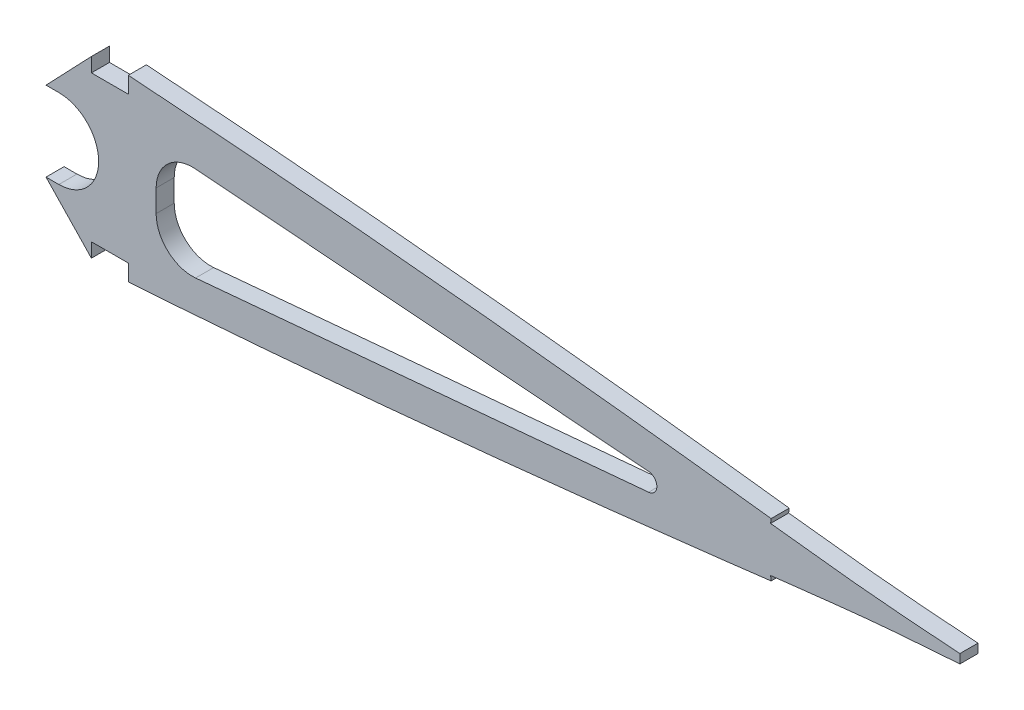
ISO-10303-21;
HEADER;
FILE_DESCRIPTION(('STEP AP214'),'2;1');
FILE_NAME('part.step','',(''),(''),'','','');
FILE_SCHEMA(('AUTOMOTIVE_DESIGN { 1 0 10303 214 1 1 1 1 }'));
ENDSEC;
DATA;
#1=APPLICATION_CONTEXT('core data for automotive mechanical design processes');
#2=APPLICATION_PROTOCOL_DEFINITION('international standard','automotive_design',2000,#1);
#3=PRODUCT_CONTEXT('',#1,'mechanical');
#4=PRODUCT('Part','Part','',(#3));
#5=PRODUCT_RELATED_PRODUCT_CATEGORY('part','',(#4));
#6=PRODUCT_DEFINITION_FORMATION('','',#4);
#7=PRODUCT_DEFINITION_CONTEXT('part definition',#1,'design');
#8=PRODUCT_DEFINITION('design','',#6,#7);
#9=PRODUCT_DEFINITION_SHAPE('','',#8);
#10=(LENGTH_UNIT() NAMED_UNIT(*) SI_UNIT(.MILLI.,.METRE.));
#11=(NAMED_UNIT(*) PLANE_ANGLE_UNIT() SI_UNIT($,.RADIAN.));
#12=(NAMED_UNIT(*) SI_UNIT($,.STERADIAN.) SOLID_ANGLE_UNIT());
#13=UNCERTAINTY_MEASURE_WITH_UNIT(LENGTH_MEASURE(1.E-05),#10,'distance_accuracy_value','');
#14=(GEOMETRIC_REPRESENTATION_CONTEXT(3) GLOBAL_UNCERTAINTY_ASSIGNED_CONTEXT((#13)) GLOBAL_UNIT_ASSIGNED_CONTEXT((#10,
#11,#12)) REPRESENTATION_CONTEXT('',''));
#15=CARTESIAN_POINT('',(0.,0.,0.));
#16=DIRECTION('',(0.,0.,1.));
#17=DIRECTION('',(1.,0.,0.));
#18=AXIS2_PLACEMENT_3D('',#15,#16,#17);
#19=CARTESIAN_POINT('',(27.0520222147279,292.342130035298,-3.175));
#20=DIRECTION('',(0.999999998914993,-4.65834175230842E-05,0.));
#21=DIRECTION('',(4.65834175230842E-05,0.999999998914993,0.));
#22=AXIS2_PLACEMENT_3D('',#19,#20,#21);
#23=PLANE('',#22);
#24=DIRECTION('',(4.65834175230842E-05,0.999999998914993,0.));
#25=VECTOR('',#24,1.);
#26=CARTESIAN_POINT('',(27.0520222147279,292.342130035298,0.));
#27=LINE('',#26,#25);
#28=CARTESIAN_POINT('',(27.0518880174241,289.461334448386,0.));
#29=VERTEX_POINT('',#28);
#30=CARTESIAN_POINT('',(27.0520222147279,292.342130035298,0.));
#31=VERTEX_POINT('',#30);
#32=EDGE_CURVE('E246',#29,#31,#27,.T.);
#33=ORIENTED_EDGE('',*,*,#32,.T.);
#34=DIRECTION('',(0.,0.,1.));
#35=VECTOR('',#34,1.);
#36=CARTESIAN_POINT('',(27.0520222147279,292.342130035298,-3.175));
#37=LINE('',#36,#35);
#38=CARTESIAN_POINT('',(27.0520222147279,292.342130035298,-3.175));
#39=VERTEX_POINT('',#38);
#40=EDGE_CURVE('E10',#39,#31,#37,.T.);
#41=ORIENTED_EDGE('',*,*,#40,.F.);
#42=DIRECTION('',(4.65834175230842E-05,0.999999998914993,0.));
#43=VECTOR('',#42,1.);
#44=CARTESIAN_POINT('',(27.0520222147279,292.342130035298,-3.175));
#45=LINE('',#44,#43);
#46=CARTESIAN_POINT('',(27.0518880174241,289.461334448386,-3.175));
#47=VERTEX_POINT('',#46);
#48=EDGE_CURVE('E343',#47,#39,#45,.T.);
#49=ORIENTED_EDGE('',*,*,#48,.F.);
#50=DIRECTION('',(0.,0.,1.));
#51=VECTOR('',#50,1.);
#52=CARTESIAN_POINT('',(27.0518880174241,289.461334448386,-3.175));
#53=LINE('',#52,#51);
#54=EDGE_CURVE('E350',#47,#29,#53,.T.);
#55=ORIENTED_EDGE('',*,*,#54,.T.);
#56=EDGE_LOOP('',(#33,#41,#49,#55));
#57=FACE_BOUND('',#56,.T.);
#58=ADVANCED_FACE('F16',(#57),#23,.F.);
#59=CARTESIAN_POINT('',(27.0520222147279,292.342130035298,-3.175));
#60=CARTESIAN_POINT('',(31.6448637242133,292.031066167189,-3.175));
#61=CARTESIAN_POINT('',(39.9442480850821,291.431511502589,-3.175));
#62=CARTESIAN_POINT('',(51.9525524052383,290.475454819605,-3.175));
#63=CARTESIAN_POINT('',(64.9133034438081,289.36652345483,-3.175));
#64=CARTESIAN_POINT('',(79.6230501651415,288.001144890367,-3.175));
#65=CARTESIAN_POINT('',(95.9350363173077,286.368536230563,-3.175));
#66=CARTESIAN_POINT('',(111.74378553897,284.671478377911,-3.175));
#67=CARTESIAN_POINT('',(126.336494658498,283.009327899495,-3.175));
#68=CARTESIAN_POINT('',(135.609512962413,281.883858707602,-3.175));
#69=CARTESIAN_POINT('',(139.848208017424,281.369406935601,-3.175));
#70=B_SPLINE_CURVE_WITH_KNOTS('',3,(#59,#60,#61,#62,#63,#64,#65,#66,#67,#68,#69),.UNSPECIFIED.,
.F.,.F.,(4,1,1,1,1,1,1,1,4),(0.,0.121843925116102,0.220242357516159,0.318846892350224,
0.466148197253553,0.611258014801546,0.752755651791799,0.886984651406637,1.),.UNSPECIFIED.);
#71=DIRECTION('',(0.,0.,1.));
#72=VECTOR('',#71,1.);
#73=SURFACE_OF_LINEAR_EXTRUSION('',#70,#72);
#74=CARTESIAN_POINT('',(27.0520222147279,292.342130035298,0.));
#75=CARTESIAN_POINT('',(31.6448637242133,292.031066167189,0.));
#76=CARTESIAN_POINT('',(39.9442480850821,291.431511502589,0.));
#77=CARTESIAN_POINT('',(51.9525524052383,290.475454819605,0.));
#78=CARTESIAN_POINT('',(64.9133034438081,289.36652345483,0.));
#79=CARTESIAN_POINT('',(79.6230501651415,288.001144890367,0.));
#80=CARTESIAN_POINT('',(95.9350363173077,286.368536230563,0.));
#81=CARTESIAN_POINT('',(111.74378553897,284.671478377911,0.));
#82=CARTESIAN_POINT('',(126.336494658498,283.009327899495,0.));
#83=CARTESIAN_POINT('',(135.609512962413,281.883858707602,0.));
#84=CARTESIAN_POINT('',(139.848208017424,281.369406935601,0.));
#85=B_SPLINE_CURVE_WITH_KNOTS('',3,(#74,#75,#76,#77,#78,#79,#80,#81,#82,#83,#84),.UNSPECIFIED.,
.F.,.F.,(4,1,1,1,1,1,1,1,4),(0.,0.121843925116102,0.220242357516159,0.318846892350224,
0.466148197253553,0.611258014801546,0.752755651791799,0.886984651406637,1.),.UNSPECIFIED.);
#86=CARTESIAN_POINT('',(139.848208017424,281.369406935601,0.));
#87=VERTEX_POINT('',#86);
#88=EDGE_CURVE('E240',#31,#87,#85,.T.);
#89=ORIENTED_EDGE('',*,*,#88,.T.);
#90=DIRECTION('',(0.,0.,1.));
#91=VECTOR('',#90,1.);
#92=CARTESIAN_POINT('',(139.848208017424,281.369406935601,-3.175));
#93=LINE('',#92,#91);
#94=CARTESIAN_POINT('',(139.848208017424,281.369406935601,-3.175));
#95=VERTEX_POINT('',#94);
#96=EDGE_CURVE('E24',#95,#87,#93,.T.);
#97=ORIENTED_EDGE('',*,*,#96,.F.);
#98=EDGE_CURVE('E134',#39,#95,#70,.T.);
#99=ORIENTED_EDGE('',*,*,#98,.F.);
#100=ORIENTED_EDGE('',*,*,#40,.T.);
#101=EDGE_LOOP('',(#89,#97,#99,#100));
#102=FACE_BOUND('',#101,.T.);
#103=ADVANCED_FACE('F465',(#102),#73,.F.);
#104=CARTESIAN_POINT('',(139.848208017424,281.369406935601,-3.175));
#105=DIRECTION('',(-0.992570614202239,0.121669946257036,0.));
#106=DIRECTION('',(-0.121669946257036,-0.992570614202239,0.));
#107=AXIS2_PLACEMENT_3D('',#104,#105,#106);
#108=PLANE('',#107);
#109=DIRECTION('',(-0.121669946257036,-0.992570614202239,0.));
#110=VECTOR('',#109,1.);
#111=CARTESIAN_POINT('',(139.848208017424,281.369406935601,0.));
#112=LINE('',#111,#110);
#113=CARTESIAN_POINT('',(139.751688017424,280.582006935601,0.));
#114=VERTEX_POINT('',#113);
#115=EDGE_CURVE('E245',#87,#114,#112,.T.);
#116=ORIENTED_EDGE('',*,*,#115,.T.);
#117=DIRECTION('',(0.,0.,1.));
#118=VECTOR('',#117,1.);
#119=CARTESIAN_POINT('',(139.751688017424,280.582006935601,-3.175));
#120=LINE('',#119,#118);
#121=CARTESIAN_POINT('',(139.751688017424,280.582006935601,-3.175));
#122=VERTEX_POINT('',#121);
#123=EDGE_CURVE('E409',#122,#114,#120,.T.);
#124=ORIENTED_EDGE('',*,*,#123,.F.);
#125=DIRECTION('',(-0.121669946257036,-0.992570614202239,0.));
#126=VECTOR('',#125,1.);
#127=CARTESIAN_POINT('',(139.848208017424,281.369406935601,-3.175));
#128=LINE('',#127,#126);
#129=EDGE_CURVE('E417',#95,#122,#128,.T.);
#130=ORIENTED_EDGE('',*,*,#129,.F.);
#131=ORIENTED_EDGE('',*,*,#96,.T.);
#132=EDGE_LOOP('',(#116,#124,#130,#131));
#133=FACE_BOUND('',#132,.T.);
#134=ADVANCED_FACE('F415',(#133),#108,.F.);
#135=CARTESIAN_POINT('',(139.751688017424,280.582006935601,-3.175));
#136=CARTESIAN_POINT('',(141.693886224445,280.359170647431,-3.175));
#137=CARTESIAN_POINT('',(147.65623542696,279.675086108449,-3.175));
#138=CARTESIAN_POINT('',(158.71215565358,278.413339142407,-3.175));
#139=CARTESIAN_POINT('',(167.862262086692,277.778329081846,-3.175));
#140=CARTESIAN_POINT('',(172.974888017424,277.423516935601,-3.175));
#141=B_SPLINE_CURVE_WITH_KNOTS('',3,(#135,#136,#137,#138,#139,#140),.UNSPECIFIED.,.F.,.F.,(4,1,
1,4),(0.,0.175716345954333,0.539431151456154,1.),.UNSPECIFIED.);
#142=DIRECTION('',(0.,0.,1.));
#143=VECTOR('',#142,1.);
#144=SURFACE_OF_LINEAR_EXTRUSION('',#141,#143);
#145=CARTESIAN_POINT('',(139.751688017424,280.582006935601,0.));
#146=CARTESIAN_POINT('',(141.693886224445,280.359170647431,0.));
#147=CARTESIAN_POINT('',(147.65623542696,279.675086108449,0.));
#148=CARTESIAN_POINT('',(158.71215565358,278.413339142407,0.));
#149=CARTESIAN_POINT('',(167.862262086692,277.778329081846,0.));
#150=CARTESIAN_POINT('',(172.974888017424,277.423516935601,0.));
#151=B_SPLINE_CURVE_WITH_KNOTS('',3,(#145,#146,#147,#148,#149,#150),.UNSPECIFIED.,.F.,.F.,(4,1,
1,4),(0.,0.175716345954333,0.539431151456154,1.),.UNSPECIFIED.);
#152=CARTESIAN_POINT('',(172.974888017424,277.423516935601,0.));
#153=VERTEX_POINT('',#152);
#154=EDGE_CURVE('E252',#114,#153,#151,.T.);
#155=ORIENTED_EDGE('',*,*,#154,.T.);
#156=DIRECTION('',(0.,0.,1.));
#157=VECTOR('',#156,1.);
#158=CARTESIAN_POINT('',(172.974888017424,277.423516935601,-3.175));
#159=LINE('',#158,#157);
#160=CARTESIAN_POINT('',(172.974888017424,277.423516935601,-3.175));
#161=VERTEX_POINT('',#160);
#162=EDGE_CURVE('E406',#161,#153,#159,.T.);
#163=ORIENTED_EDGE('',*,*,#162,.F.);
#164=EDGE_CURVE('E435',#122,#161,#141,.T.);
#165=ORIENTED_EDGE('',*,*,#164,.F.);
#166=ORIENTED_EDGE('',*,*,#123,.T.);
#167=EDGE_LOOP('',(#155,#163,#165,#166));
#168=FACE_BOUND('',#167,.T.);
#169=ADVANCED_FACE('F426',(#168),#144,.F.);
#170=CARTESIAN_POINT('',(172.974888017424,277.423516935601,-3.175));
#171=DIRECTION('',(-1.,0.,0.));
#172=DIRECTION('',(0.,0.,1.));
#173=AXIS2_PLACEMENT_3D('',#170,#171,#172);
#174=PLANE('',#173);
#175=DIRECTION('',(0.,-1.,0.));
#176=VECTOR('',#175,1.);
#177=CARTESIAN_POINT('',(172.974888017424,277.423516935601,0.));
#178=LINE('',#177,#176);
#179=CARTESIAN_POINT('',(172.974888017424,275.836016935601,0.));
#180=VERTEX_POINT('',#179);
#181=EDGE_CURVE('E257',#153,#180,#178,.T.);
#182=ORIENTED_EDGE('',*,*,#181,.T.);
#183=DIRECTION('',(0.,0.,1.));
#184=VECTOR('',#183,1.);
#185=CARTESIAN_POINT('',(172.974888017424,275.836016935601,-3.175));
#186=LINE('',#185,#184);
#187=CARTESIAN_POINT('',(172.974888017424,275.836016935601,-3.175));
#188=VERTEX_POINT('',#187);
#189=EDGE_CURVE('E403',#188,#180,#186,.T.);
#190=ORIENTED_EDGE('',*,*,#189,.F.);
#191=DIRECTION('',(0.,-1.,0.));
#192=VECTOR('',#191,1.);
#193=CARTESIAN_POINT('',(172.974888017424,277.423516935601,-3.175));
#194=LINE('',#193,#192);
#195=EDGE_CURVE('E432',#161,#188,#194,.T.);
#196=ORIENTED_EDGE('',*,*,#195,.F.);
#197=ORIENTED_EDGE('',*,*,#162,.T.);
#198=EDGE_LOOP('',(#182,#190,#196,#197));
#199=FACE_BOUND('',#198,.T.);
#200=ADVANCED_FACE('F430',(#199),#174,.F.);
#201=CARTESIAN_POINT('',(172.974888017424,275.836016935601,-3.175));
#202=CARTESIAN_POINT('',(167.862262086692,275.481204789356,-3.175));
#203=CARTESIAN_POINT('',(158.71215565358,274.846194728795,-3.175));
#204=CARTESIAN_POINT('',(147.65623542696,273.584447762754,-3.175));
#205=CARTESIAN_POINT('',(141.693886224445,272.900363223771,-3.175));
#206=CARTESIAN_POINT('',(139.751688017424,272.677526935601,-3.175));
#207=B_SPLINE_CURVE_WITH_KNOTS('',3,(#201,#202,#203,#204,#205,#206),.UNSPECIFIED.,.F.,.F.,(4,1,
1,4),(0.,0.460568848543846,0.824283654045667,1.),.UNSPECIFIED.);
#208=DIRECTION('',(0.,0.,1.));
#209=VECTOR('',#208,1.);
#210=SURFACE_OF_LINEAR_EXTRUSION('',#207,#209);
#211=CARTESIAN_POINT('',(172.974888017424,275.836016935601,0.));
#212=CARTESIAN_POINT('',(167.862262086692,275.481204789356,0.));
#213=CARTESIAN_POINT('',(158.71215565358,274.846194728795,0.));
#214=CARTESIAN_POINT('',(147.65623542696,273.584447762754,0.));
#215=CARTESIAN_POINT('',(141.693886224445,272.900363223771,0.));
#216=CARTESIAN_POINT('',(139.751688017424,272.677526935601,0.));
#217=B_SPLINE_CURVE_WITH_KNOTS('',3,(#211,#212,#213,#214,#215,#216),.UNSPECIFIED.,.F.,.F.,(4,1,
1,4),(0.,0.460568848543846,0.824283654045667,1.),.UNSPECIFIED.);
#218=CARTESIAN_POINT('',(139.751688017424,272.677526935601,0.));
#219=VERTEX_POINT('',#218);
#220=EDGE_CURVE('E263',#180,#219,#217,.T.);
#221=ORIENTED_EDGE('',*,*,#220,.T.);
#222=DIRECTION('',(0.,0.,1.));
#223=VECTOR('',#222,1.);
#224=CARTESIAN_POINT('',(139.751688017424,272.677526935601,-3.175));
#225=LINE('',#224,#223);
#226=CARTESIAN_POINT('',(139.751688017424,272.677526935601,-3.175));
#227=VERTEX_POINT('',#226);
#228=EDGE_CURVE('E400',#227,#219,#225,.T.);
#229=ORIENTED_EDGE('',*,*,#228,.F.);
#230=EDGE_CURVE('E434',#188,#227,#207,.T.);
#231=ORIENTED_EDGE('',*,*,#230,.F.);
#232=ORIENTED_EDGE('',*,*,#189,.T.);
#233=EDGE_LOOP('',(#221,#229,#231,#232));
#234=FACE_BOUND('',#233,.T.);
#235=ADVANCED_FACE('F453',(#234),#210,.F.);
#236=CARTESIAN_POINT('',(139.751688017424,272.677526935601,-3.175));
#237=DIRECTION('',(-0.992570614202239,-0.121669946257036,0.));
#238=DIRECTION('',(0.121669946257036,-0.992570614202239,0.));
#239=AXIS2_PLACEMENT_3D('',#236,#237,#238);
#240=PLANE('',#239);
#241=DIRECTION('',(0.121669946257036,-0.992570614202239,0.));
#242=VECTOR('',#241,1.);
#243=CARTESIAN_POINT('',(139.751688017424,272.677526935601,0.));
#244=LINE('',#243,#242);
#245=CARTESIAN_POINT('',(139.848208017424,271.890126935601,0.));
#246=VERTEX_POINT('',#245);
#247=EDGE_CURVE('E268',#219,#246,#244,.T.);
#248=ORIENTED_EDGE('',*,*,#247,.T.);
#249=DIRECTION('',(0.,0.,1.));
#250=VECTOR('',#249,1.);
#251=CARTESIAN_POINT('',(139.848208017424,271.890126935601,-3.175));
#252=LINE('',#251,#250);
#253=CARTESIAN_POINT('',(139.848208017424,271.890126935601,-3.175));
#254=VERTEX_POINT('',#253);
#255=EDGE_CURVE('E397',#254,#246,#252,.T.);
#256=ORIENTED_EDGE('',*,*,#255,.F.);
#257=DIRECTION('',(0.121669946257036,-0.992570614202239,0.));
#258=VECTOR('',#257,1.);
#259=CARTESIAN_POINT('',(139.751688017424,272.677526935601,-3.175));
#260=LINE('',#259,#258);
#261=EDGE_CURVE('E437',#227,#254,#260,.T.);
#262=ORIENTED_EDGE('',*,*,#261,.F.);
#263=ORIENTED_EDGE('',*,*,#228,.T.);
#264=EDGE_LOOP('',(#248,#256,#262,#263));
#265=FACE_BOUND('',#264,.T.);
#266=ADVANCED_FACE('F457',(#265),#240,.F.);
#267=CARTESIAN_POINT('',(-576.700717849438,6163.99250093798,-3.175));
#268=DIRECTION('',(0.,0.,1.));
#269=DIRECTION('',(1.,0.,0.));
#270=AXIS2_PLACEMENT_3D('',#267,#268,#269);
#271=CYLINDRICAL_SURFACE('',#270,5935.51284632469);
#272=CARTESIAN_POINT('',(-576.700717849438,6163.99250093798,0.));
#273=DIRECTION('',(0.,0.,-1.));
#274=DIRECTION('',(1.,0.,0.));
#275=AXIS2_PLACEMENT_3D('',#272,#273,#274);
#276=CIRCLE('',#275,5935.51284632469);
#277=CARTESIAN_POINT('',(131.976748017424,270.93819962207,0.));
#278=VERTEX_POINT('',#277);
#279=EDGE_CURVE('E274',#246,#278,#276,.T.);
#280=ORIENTED_EDGE('',*,*,#279,.T.);
#281=DIRECTION('',(0.,0.,1.));
#282=VECTOR('',#281,1.);
#283=CARTESIAN_POINT('',(131.976748017424,270.93819962207,-3.175));
#284=LINE('',#283,#282);
#285=CARTESIAN_POINT('',(131.976748017424,270.93819962207,-3.175));
#286=VERTEX_POINT('',#285);
#287=EDGE_CURVE('E394',#286,#278,#284,.T.);
#288=ORIENTED_EDGE('',*,*,#287,.F.);
#289=CARTESIAN_POINT('',(-576.700717849438,6163.99250093798,-3.175));
#290=DIRECTION('',(0.,0.,-1.));
#291=DIRECTION('',(1.,0.,0.));
#292=AXIS2_PLACEMENT_3D('',#289,#290,#291);
#293=CIRCLE('',#292,5935.51284632469);
#294=EDGE_CURVE('E567',#254,#286,#293,.T.);
#295=ORIENTED_EDGE('',*,*,#294,.F.);
#296=ORIENTED_EDGE('',*,*,#255,.T.);
#297=EDGE_LOOP('',(#280,#288,#295,#296));
#298=FACE_BOUND('',#297,.T.);
#299=ADVANCED_FACE('F566',(#298),#271,.T.);
#300=CARTESIAN_POINT('',(112.014888017424,268.635021748224,-3.175));
#301=DIRECTION('',(-0.114618525740155,0.993409579960428,0.));
#302=DIRECTION('',(-0.993409579960428,-0.114618525740155,0.));
#303=AXIS2_PLACEMENT_3D('',#300,#301,#302);
#304=PLANE('',#303);
#305=DIRECTION('',(-0.993409579960428,-0.114618525740155,0.));
#306=VECTOR('',#305,1.);
#307=CARTESIAN_POINT('',(112.014888017424,268.635021748224,0.));
#308=LINE('',#307,#306);
#309=CARTESIAN_POINT('',(112.014888017424,268.635021748224,0.));
#310=VERTEX_POINT('',#309);
#311=EDGE_CURVE('E277',#278,#310,#308,.T.);
#312=ORIENTED_EDGE('',*,*,#311,.T.);
#313=DIRECTION('',(0.,0.,1.));
#314=VECTOR('',#313,1.);
#315=CARTESIAN_POINT('',(112.014888017424,268.635021748224,-3.175));
#316=LINE('',#315,#314);
#317=CARTESIAN_POINT('',(112.014888017424,268.635021748224,-3.175));
#318=VERTEX_POINT('',#317);
#319=EDGE_CURVE('E391',#318,#310,#316,.T.);
#320=ORIENTED_EDGE('',*,*,#319,.F.);
#321=DIRECTION('',(-0.993409579960428,-0.114618525740155,0.));
#322=VECTOR('',#321,1.);
#323=CARTESIAN_POINT('',(112.014888017424,268.635021748224,-3.175));
#324=LINE('',#323,#322);
#325=EDGE_CURVE('E562',#286,#318,#324,.T.);
#326=ORIENTED_EDGE('',*,*,#325,.F.);
#327=ORIENTED_EDGE('',*,*,#287,.T.);
#328=EDGE_LOOP('',(#312,#320,#326,#327));
#329=FACE_BOUND('',#328,.T.);
#330=ADVANCED_FACE('F561',(#329),#304,.F.);
#331=CARTESIAN_POINT('',(112.014888017424,268.635021748224,-3.175));
#332=CARTESIAN_POINT('',(106.70146429459,268.046765936263,-3.175));
#333=CARTESIAN_POINT('',(95.9350363173077,266.890997640639,-3.175));
#334=CARTESIAN_POINT('',(79.6230501651415,265.258388980836,-3.175));
#335=CARTESIAN_POINT('',(64.9133034438081,263.893010416372,-3.175));
#336=CARTESIAN_POINT('',(55.4573573614696,263.083952734211,-3.175));
#337=CARTESIAN_POINT('',(51.5453134743603,262.761502611849,-3.175));
#338=CARTESIAN_POINT('',(51.3460222819361,262.745108056837,-3.175));
#339=B_SPLINE_CURVE_WITH_KNOTS('',3,(#331,#332,#333,#334,#335,#336,#337,#338),.UNSPECIFIED.,.F.,
.F.,(4,1,1,1,1,4),(0.,0.263101602171932,0.532919715744979,0.806812694782869,0.990158591209731,
1.),.UNSPECIFIED.);
#340=DIRECTION('',(0.,0.,1.));
#341=VECTOR('',#340,1.);
#342=SURFACE_OF_LINEAR_EXTRUSION('',#339,#341);
#343=CARTESIAN_POINT('',(112.014888017424,268.635021748224,0.));
#344=CARTESIAN_POINT('',(106.70146429459,268.046765936263,0.));
#345=CARTESIAN_POINT('',(95.9350363173077,266.890997640639,0.));
#346=CARTESIAN_POINT('',(79.6230501651415,265.258388980836,0.));
#347=CARTESIAN_POINT('',(64.9133034438081,263.893010416372,0.));
#348=CARTESIAN_POINT('',(55.4573573614696,263.083952734211,0.));
#349=CARTESIAN_POINT('',(51.5453134743603,262.761502611849,0.));
#350=CARTESIAN_POINT('',(51.3460222819361,262.745108056837,0.));
#351=B_SPLINE_CURVE_WITH_KNOTS('',3,(#343,#344,#345,#346,#347,#348,#349,#350),.UNSPECIFIED.,.F.,
.F.,(4,1,1,1,1,4),(0.,0.263101602171932,0.532919715744979,0.806812694782869,0.990158591209731,
1.),.UNSPECIFIED.);
#352=CARTESIAN_POINT('',(51.3460222819361,262.745108056837,0.));
#353=VERTEX_POINT('',#352);
#354=EDGE_CURVE('E280',#310,#353,#351,.T.);
#355=ORIENTED_EDGE('',*,*,#354,.T.);
#356=DIRECTION('',(0.,0.,1.));
#357=VECTOR('',#356,1.);
#358=CARTESIAN_POINT('',(51.3460222819361,262.745108056837,-3.175));
#359=LINE('',#358,#357);
#360=CARTESIAN_POINT('',(51.3460222819361,262.745108056837,-3.175));
#361=VERTEX_POINT('',#360);
#362=EDGE_CURVE('E388',#361,#353,#359,.T.);
#363=ORIENTED_EDGE('',*,*,#362,.F.);
#364=EDGE_CURVE('E558',#318,#361,#339,.T.);
#365=ORIENTED_EDGE('',*,*,#364,.F.);
#366=ORIENTED_EDGE('',*,*,#319,.T.);
#367=EDGE_LOOP('',(#355,#363,#365,#366));
#368=FACE_BOUND('',#367,.T.);
#369=ADVANCED_FACE('F555',(#368),#342,.F.);
#370=CARTESIAN_POINT('',(35.284028017424,261.496710225391,-3.175));
#371=DIRECTION('',(-0.0774900077384121,0.996993128712882,0.));
#372=DIRECTION('',(-0.996993128712882,-0.0774900077384121,0.));
#373=AXIS2_PLACEMENT_3D('',#370,#371,#372);
#374=PLANE('',#373);
#375=DIRECTION('',(-0.996993128712882,-0.0774900077384121,0.));
#376=VECTOR('',#375,1.);
#377=CARTESIAN_POINT('',(35.284028017424,261.496710225391,0.));
#378=LINE('',#377,#376);
#379=CARTESIAN_POINT('',(35.284028017424,261.496710225391,0.));
#380=VERTEX_POINT('',#379);
#381=EDGE_CURVE('E285',#353,#380,#378,.T.);
#382=ORIENTED_EDGE('',*,*,#381,.T.);
#383=DIRECTION('',(0.,0.,1.));
#384=VECTOR('',#383,1.);
#385=CARTESIAN_POINT('',(35.284028017424,261.496710225391,-3.175));
#386=LINE('',#385,#384);
#387=CARTESIAN_POINT('',(35.284028017424,261.496710225391,-3.175));
#388=VERTEX_POINT('',#387);
#389=EDGE_CURVE('E385',#388,#380,#386,.T.);
#390=ORIENTED_EDGE('',*,*,#389,.F.);
#391=DIRECTION('',(-0.996993128712882,-0.0774900077384121,0.));
#392=VECTOR('',#391,1.);
#393=CARTESIAN_POINT('',(35.284028017424,261.496710225391,-3.175));
#394=LINE('',#393,#392);
#395=EDGE_CURVE('E549',#361,#388,#394,.T.);
#396=ORIENTED_EDGE('',*,*,#395,.F.);
#397=ORIENTED_EDGE('',*,*,#362,.T.);
#398=EDGE_LOOP('',(#382,#390,#396,#397));
#399=FACE_BOUND('',#398,.T.);
#400=ADVANCED_FACE('F548',(#399),#374,.F.);
#401=CARTESIAN_POINT('',(27.0518880174241,260.919385251975,-3.175));
#402=DIRECTION('',(-0.0699587786102448,0.997549883111297,0.));
#403=DIRECTION('',(-0.997549883111297,-0.0699587786102448,0.));
#404=AXIS2_PLACEMENT_3D('',#401,#402,#403);
#405=PLANE('',#404);
#406=DIRECTION('',(-0.997549883111297,-0.0699587786102448,0.));
#407=VECTOR('',#406,1.);
#408=CARTESIAN_POINT('',(27.0518880174241,260.919385251975,0.));
#409=LINE('',#408,#407);
#410=CARTESIAN_POINT('',(27.0518880174241,260.919385251975,0.));
#411=VERTEX_POINT('',#410);
#412=EDGE_CURVE('E291',#380,#411,#409,.T.);
#413=ORIENTED_EDGE('',*,*,#412,.T.);
#414=DIRECTION('',(0.,0.,1.));
#415=VECTOR('',#414,1.);
#416=CARTESIAN_POINT('',(27.0518880174241,260.919385251975,-3.175));
#417=LINE('',#416,#415);
#418=CARTESIAN_POINT('',(27.0518880174241,260.919385251975,-3.175));
#419=VERTEX_POINT('',#418);
#420=EDGE_CURVE('E382',#419,#411,#417,.T.);
#421=ORIENTED_EDGE('',*,*,#420,.F.);
#422=DIRECTION('',(-0.997549883111297,-0.0699587786102448,0.));
#423=VECTOR('',#422,1.);
#424=CARTESIAN_POINT('',(27.0518880174241,260.919385251975,-3.175));
#425=LINE('',#424,#423);
#426=EDGE_CURVE('E544',#388,#419,#425,.T.);
#427=ORIENTED_EDGE('',*,*,#426,.F.);
#428=ORIENTED_EDGE('',*,*,#389,.T.);
#429=EDGE_LOOP('',(#413,#421,#427,#428));
#430=FACE_BOUND('',#429,.T.);
#431=ADVANCED_FACE('F543',(#430),#405,.F.);
#432=CARTESIAN_POINT('',(27.0518880174241,263.798199422816,-3.175));
#433=DIRECTION('',(1.,0.,0.));
#434=DIRECTION('',(0.,0.,-1.));
#435=AXIS2_PLACEMENT_3D('',#432,#433,#434);
#436=PLANE('',#435);
#437=DIRECTION('',(0.,1.,0.));
#438=VECTOR('',#437,1.);
#439=CARTESIAN_POINT('',(27.0518880174241,263.798199422816,0.));
#440=LINE('',#439,#438);
#441=CARTESIAN_POINT('',(27.0518880174241,263.798199422816,0.));
#442=VERTEX_POINT('',#441);
#443=EDGE_CURVE('E294',#411,#442,#440,.T.);
#444=ORIENTED_EDGE('',*,*,#443,.T.);
#445=DIRECTION('',(0.,0.,1.));
#446=VECTOR('',#445,1.);
#447=CARTESIAN_POINT('',(27.0518880174241,263.798199422816,-3.175));
#448=LINE('',#447,#446);
#449=CARTESIAN_POINT('',(27.0518880174241,263.798199422816,-3.175));
#450=VERTEX_POINT('',#449);
#451=EDGE_CURVE('E379',#450,#442,#448,.T.);
#452=ORIENTED_EDGE('',*,*,#451,.F.);
#453=DIRECTION('',(0.,1.,0.));
#454=VECTOR('',#453,1.);
#455=CARTESIAN_POINT('',(27.0518880174241,263.798199422816,-3.175));
#456=LINE('',#455,#454);
#457=EDGE_CURVE('E540',#419,#450,#456,.T.);
#458=ORIENTED_EDGE('',*,*,#457,.F.);
#459=ORIENTED_EDGE('',*,*,#420,.T.);
#460=EDGE_LOOP('',(#444,#452,#458,#459));
#461=FACE_BOUND('',#460,.T.);
#462=ADVANCED_FACE('F537',(#461),#436,.F.);
#463=CARTESIAN_POINT('',(20.5748880174241,263.798199422816,-3.175));
#464=DIRECTION('',(0.,1.,0.));
#465=DIRECTION('',(0.,0.,1.));
#466=AXIS2_PLACEMENT_3D('',#463,#464,#465);
#467=PLANE('',#466);
#468=DIRECTION('',(-1.,0.,0.));
#469=VECTOR('',#468,1.);
#470=CARTESIAN_POINT('',(20.5748880174241,263.798199422816,0.));
#471=LINE('',#470,#469);
#472=CARTESIAN_POINT('',(20.5748880174241,263.798199422816,0.));
#473=VERTEX_POINT('',#472);
#474=EDGE_CURVE('E297',#442,#473,#471,.T.);
#475=ORIENTED_EDGE('',*,*,#474,.T.);
#476=DIRECTION('',(0.,0.,1.));
#477=VECTOR('',#476,1.);
#478=CARTESIAN_POINT('',(20.5748880174241,263.798199422816,-3.175));
#479=LINE('',#478,#477);
#480=CARTESIAN_POINT('',(20.5748880174241,263.798199422816,-3.175));
#481=VERTEX_POINT('',#480);
#482=EDGE_CURVE('E376',#481,#473,#479,.T.);
#483=ORIENTED_EDGE('',*,*,#482,.F.);
#484=DIRECTION('',(-1.,0.,0.));
#485=VECTOR('',#484,1.);
#486=CARTESIAN_POINT('',(20.5748880174241,263.798199422816,-3.175));
#487=LINE('',#486,#485);
#488=EDGE_CURVE('E531',#450,#481,#487,.T.);
#489=ORIENTED_EDGE('',*,*,#488,.F.);
#490=ORIENTED_EDGE('',*,*,#451,.T.);
#491=EDGE_LOOP('',(#475,#483,#489,#490));
#492=FACE_BOUND('',#491,.T.);
#493=ADVANCED_FACE('F530',(#492),#467,.F.);
#494=CARTESIAN_POINT('',(20.5748880174241,261.302141142365,-3.175));
#495=DIRECTION('',(-1.,0.,0.));
#496=DIRECTION('',(0.,0.,1.));
#497=AXIS2_PLACEMENT_3D('',#494,#495,#496);
#498=PLANE('',#497);
#499=DIRECTION('',(0.,-1.,0.));
#500=VECTOR('',#499,1.);
#501=CARTESIAN_POINT('',(20.5748880174241,261.302141142365,0.));
#502=LINE('',#501,#500);
#503=CARTESIAN_POINT('',(20.5748880174241,261.302141142365,0.));
#504=VERTEX_POINT('',#503);
#505=EDGE_CURVE('E300',#473,#504,#502,.T.);
#506=ORIENTED_EDGE('',*,*,#505,.T.);
#507=DIRECTION('',(0.,0.,1.));
#508=VECTOR('',#507,1.);
#509=CARTESIAN_POINT('',(20.5748880174241,261.302141142365,-3.175));
#510=LINE('',#509,#508);
#511=CARTESIAN_POINT('',(20.5748880174241,261.302141142365,-3.175));
#512=VERTEX_POINT('',#511);
#513=EDGE_CURVE('E373',#512,#504,#510,.T.);
#514=ORIENTED_EDGE('',*,*,#513,.F.);
#515=DIRECTION('',(0.,-1.,0.));
#516=VECTOR('',#515,1.);
#517=CARTESIAN_POINT('',(20.5748880174241,261.302141142365,-3.175));
#518=LINE('',#517,#516);
#519=EDGE_CURVE('E526',#481,#512,#518,.T.);
#520=ORIENTED_EDGE('',*,*,#519,.F.);
#521=ORIENTED_EDGE('',*,*,#482,.T.);
#522=EDGE_LOOP('',(#506,#514,#520,#521));
#523=FACE_BOUND('',#522,.T.);
#524=ADVANCED_FACE('F525',(#523),#498,.F.);
#525=CARTESIAN_POINT('',(12.609328477006,269.644766935601,-3.175));
#526=DIRECTION('',(0.72326270074206,0.690572998107587,0.));
#527=DIRECTION('',(-0.690572998107588,0.72326270074206,0.));
#528=AXIS2_PLACEMENT_3D('',#525,#526,#527);
#529=PLANE('',#528);
#530=DIRECTION('',(-0.690572998107588,0.72326270074206,0.));
#531=VECTOR('',#530,1.);
#532=CARTESIAN_POINT('',(12.609328477006,269.644766935601,0.));
#533=LINE('',#532,#531);
#534=CARTESIAN_POINT('',(12.609328477006,269.644766935601,0.));
#535=VERTEX_POINT('',#534);
#536=EDGE_CURVE('E303',#504,#535,#533,.T.);
#537=ORIENTED_EDGE('',*,*,#536,.T.);
#538=DIRECTION('',(0.,0.,1.));
#539=VECTOR('',#538,1.);
#540=CARTESIAN_POINT('',(12.609328477006,269.644766935601,-3.175));
#541=LINE('',#540,#539);
#542=CARTESIAN_POINT('',(12.609328477006,269.644766935601,-3.175));
#543=VERTEX_POINT('',#542);
#544=EDGE_CURVE('E370',#543,#535,#541,.T.);
#545=ORIENTED_EDGE('',*,*,#544,.F.);
#546=DIRECTION('',(-0.690572998107588,0.72326270074206,0.));
#547=VECTOR('',#546,1.);
#548=CARTESIAN_POINT('',(12.609328477006,269.644766935601,-3.175));
#549=LINE('',#548,#547);
#550=EDGE_CURVE('E522',#512,#543,#549,.T.);
#551=ORIENTED_EDGE('',*,*,#550,.F.);
#552=ORIENTED_EDGE('',*,*,#513,.T.);
#553=EDGE_LOOP('',(#537,#545,#551,#552));
#554=FACE_BOUND('',#553,.T.);
#555=ADVANCED_FACE('F519',(#554),#529,.F.);
#556=CARTESIAN_POINT('',(12.609328477006,269.644766935601,-3.175));
#557=DIRECTION('',(0.,-1.,0.));
#558=DIRECTION('',(0.,0.,-1.));
#559=AXIS2_PLACEMENT_3D('',#556,#557,#558);
#560=PLANE('',#559);
#561=DIRECTION('',(1.,0.,0.));
#562=VECTOR('',#561,1.);
#563=CARTESIAN_POINT('',(12.609328477006,269.644766935601,0.));
#564=LINE('',#563,#562);
#565=CARTESIAN_POINT('',(14.8598880174241,269.644766935601,0.));
#566=VERTEX_POINT('',#565);
#567=EDGE_CURVE('E306',#535,#566,#564,.T.);
#568=ORIENTED_EDGE('',*,*,#567,.T.);
#569=DIRECTION('',(0.,0.,1.));
#570=VECTOR('',#569,1.);
#571=CARTESIAN_POINT('',(14.8598880174241,269.644766935601,-3.175));
#572=LINE('',#571,#570);
#573=CARTESIAN_POINT('',(14.8598880174241,269.644766935601,-3.175));
#574=VERTEX_POINT('',#573);
#575=EDGE_CURVE('E367',#574,#566,#572,.T.);
#576=ORIENTED_EDGE('',*,*,#575,.F.);
#577=DIRECTION('',(1.,0.,0.));
#578=VECTOR('',#577,1.);
#579=CARTESIAN_POINT('',(12.609328477006,269.644766935601,-3.175));
#580=LINE('',#579,#578);
#581=EDGE_CURVE('E513',#543,#574,#580,.T.);
#582=ORIENTED_EDGE('',*,*,#581,.F.);
#583=ORIENTED_EDGE('',*,*,#544,.T.);
#584=EDGE_LOOP('',(#568,#576,#582,#583));
#585=FACE_BOUND('',#584,.T.);
#586=ADVANCED_FACE('F512',(#585),#560,.F.);
#587=CARTESIAN_POINT('',(14.8598880174241,276.629766935601,-3.175));
#588=DIRECTION('',(0.,0.,1.));
#589=DIRECTION('',(1.,0.,0.));
#590=AXIS2_PLACEMENT_3D('',#587,#588,#589);
#591=CYLINDRICAL_SURFACE('',#590,6.985);
#592=CARTESIAN_POINT('',(14.8598880174241,276.629766935601,0.));
#593=DIRECTION('',(0.,0.,1.));
#594=DIRECTION('',(-1.,0.,0.));
#595=AXIS2_PLACEMENT_3D('',#592,#593,#594);
#596=CIRCLE('',#595,6.985);
#597=CARTESIAN_POINT('',(14.8598880174241,283.614766935601,0.));
#598=VERTEX_POINT('',#597);
#599=EDGE_CURVE('E309',#566,#598,#596,.T.);
#600=ORIENTED_EDGE('',*,*,#599,.T.);
#601=DIRECTION('',(0.,0.,1.));
#602=VECTOR('',#601,1.);
#603=CARTESIAN_POINT('',(14.8598880174241,283.614766935601,-3.175));
#604=LINE('',#603,#602);
#605=CARTESIAN_POINT('',(14.8598880174241,283.614766935601,-3.175));
#606=VERTEX_POINT('',#605);
#607=EDGE_CURVE('E364',#606,#598,#604,.T.);
#608=ORIENTED_EDGE('',*,*,#607,.F.);
#609=CARTESIAN_POINT('',(14.8598880174241,276.629766935601,-3.175));
#610=DIRECTION('',(0.,0.,1.));
#611=DIRECTION('',(-1.,0.,0.));
#612=AXIS2_PLACEMENT_3D('',#609,#610,#611);
#613=CIRCLE('',#612,6.985);
#614=EDGE_CURVE('E508',#574,#606,#613,.T.);
#615=ORIENTED_EDGE('',*,*,#614,.F.);
#616=ORIENTED_EDGE('',*,*,#575,.T.);
#617=EDGE_LOOP('',(#600,#608,#615,#616));
#618=FACE_BOUND('',#617,.T.);
#619=ADVANCED_FACE('F507',(#618),#591,.F.);
#620=CARTESIAN_POINT('',(12.609328477006,283.614766935601,-3.175));
#621=DIRECTION('',(0.,1.,0.));
#622=DIRECTION('',(0.,0.,1.));
#623=AXIS2_PLACEMENT_3D('',#620,#621,#622);
#624=PLANE('',#623);
#625=DIRECTION('',(-1.,0.,0.));
#626=VECTOR('',#625,1.);
#627=CARTESIAN_POINT('',(12.609328477006,283.614766935601,0.));
#628=LINE('',#627,#626);
#629=CARTESIAN_POINT('',(12.609328477006,283.614766935601,0.));
#630=VERTEX_POINT('',#629);
#631=EDGE_CURVE('E312',#598,#630,#628,.T.);
#632=ORIENTED_EDGE('',*,*,#631,.T.);
#633=DIRECTION('',(0.,0.,1.));
#634=VECTOR('',#633,1.);
#635=CARTESIAN_POINT('',(12.609328477006,283.614766935601,-3.175));
#636=LINE('',#635,#634);
#637=CARTESIAN_POINT('',(12.609328477006,283.614766935601,-3.175));
#638=VERTEX_POINT('',#637);
#639=EDGE_CURVE('E361',#638,#630,#636,.T.);
#640=ORIENTED_EDGE('',*,*,#639,.F.);
#641=DIRECTION('',(-1.,0.,0.));
#642=VECTOR('',#641,1.);
#643=CARTESIAN_POINT('',(12.609328477006,283.614766935601,-3.175));
#644=LINE('',#643,#642);
#645=EDGE_CURVE('E504',#606,#638,#644,.T.);
#646=ORIENTED_EDGE('',*,*,#645,.F.);
#647=ORIENTED_EDGE('',*,*,#607,.T.);
#648=EDGE_LOOP('',(#632,#640,#646,#647));
#649=FACE_BOUND('',#648,.T.);
#650=ADVANCED_FACE('F501',(#649),#624,.F.);
#651=CARTESIAN_POINT('',(12.609328477006,283.614766935601,-3.175));
#652=DIRECTION('',(0.72326270074206,-0.690572998107587,0.));
#653=DIRECTION('',(0.690572998107588,0.72326270074206,0.));
#654=AXIS2_PLACEMENT_3D('',#651,#652,#653);
#655=PLANE('',#654);
#656=DIRECTION('',(0.690572998107588,0.72326270074206,0.));
#657=VECTOR('',#656,1.);
#658=CARTESIAN_POINT('',(12.609328477006,283.614766935601,0.));
#659=LINE('',#658,#657);
#660=CARTESIAN_POINT('',(20.5748880174241,291.957392728837,0.));
#661=VERTEX_POINT('',#660);
#662=EDGE_CURVE('E315',#630,#661,#659,.T.);
#663=ORIENTED_EDGE('',*,*,#662,.T.);
#664=DIRECTION('',(0.,0.,1.));
#665=VECTOR('',#664,1.);
#666=CARTESIAN_POINT('',(20.5748880174241,291.957392728837,-3.175));
#667=LINE('',#666,#665);
#668=CARTESIAN_POINT('',(20.5748880174241,291.957392728837,-3.175));
#669=VERTEX_POINT('',#668);
#670=EDGE_CURVE('E358',#669,#661,#667,.T.);
#671=ORIENTED_EDGE('',*,*,#670,.F.);
#672=DIRECTION('',(0.690572998107588,0.72326270074206,0.));
#673=VECTOR('',#672,1.);
#674=CARTESIAN_POINT('',(12.609328477006,283.614766935601,-3.175));
#675=LINE('',#674,#673);
#676=EDGE_CURVE('E495',#638,#669,#675,.T.);
#677=ORIENTED_EDGE('',*,*,#676,.F.);
#678=ORIENTED_EDGE('',*,*,#639,.T.);
#679=EDGE_LOOP('',(#663,#671,#677,#678));
#680=FACE_BOUND('',#679,.T.);
#681=ADVANCED_FACE('F494',(#680),#655,.F.);
#682=CARTESIAN_POINT('',(20.5748880174241,291.957392728837,-3.175));
#683=DIRECTION('',(-1.,0.,0.));
#684=DIRECTION('',(0.,0.,1.));
#685=AXIS2_PLACEMENT_3D('',#682,#683,#684);
#686=PLANE('',#685);
#687=DIRECTION('',(0.,-1.,0.));
#688=VECTOR('',#687,1.);
#689=CARTESIAN_POINT('',(20.5748880174241,291.957392728837,0.));
#690=LINE('',#689,#688);
#691=CARTESIAN_POINT('',(20.5748880174241,289.461334448386,0.));
#692=VERTEX_POINT('',#691);
#693=EDGE_CURVE('E318',#661,#692,#690,.T.);
#694=ORIENTED_EDGE('',*,*,#693,.T.);
#695=DIRECTION('',(0.,0.,1.));
#696=VECTOR('',#695,1.);
#697=CARTESIAN_POINT('',(20.5748880174241,289.461334448386,-3.175));
#698=LINE('',#697,#696);
#699=CARTESIAN_POINT('',(20.5748880174241,289.461334448386,-3.175));
#700=VERTEX_POINT('',#699);
#701=EDGE_CURVE('E355',#700,#692,#698,.T.);
#702=ORIENTED_EDGE('',*,*,#701,.F.);
#703=DIRECTION('',(0.,-1.,0.));
#704=VECTOR('',#703,1.);
#705=CARTESIAN_POINT('',(20.5748880174241,291.957392728837,-3.175));
#706=LINE('',#705,#704);
#707=EDGE_CURVE('E490',#669,#700,#706,.T.);
#708=ORIENTED_EDGE('',*,*,#707,.F.);
#709=ORIENTED_EDGE('',*,*,#670,.T.);
#710=EDGE_LOOP('',(#694,#702,#708,#709));
#711=FACE_BOUND('',#710,.T.);
#712=ADVANCED_FACE('F489',(#711),#686,.F.);
#713=CARTESIAN_POINT('',(118.211768759988,276.211359260069,-3.175));
#714=DIRECTION('',(0.,0.,1.));
#715=DIRECTION('',(1.,0.,0.));
#716=AXIS2_PLACEMENT_3D('',#713,#714,#715);
#717=CYLINDRICAL_SURFACE('',#716,1.5875);
#718=CARTESIAN_POINT('',(118.211768759988,276.211359260069,0.));
#719=DIRECTION('',(0.,0.,1.));
#720=DIRECTION('',(-1.,0.,0.));
#721=AXIS2_PLACEMENT_3D('',#718,#719,#720);
#722=CIRCLE('',#721,1.5875);
#723=CARTESIAN_POINT('',(118.354879795783,274.630323055097,0.));
#724=VERTEX_POINT('',#723);
#725=CARTESIAN_POINT('',(118.335096212405,277.794061566089,0.));
#726=VERTEX_POINT('',#725);
#727=EDGE_CURVE('E324',#724,#726,#722,.T.);
#728=ORIENTED_EDGE('',*,*,#727,.T.);
#729=DIRECTION('',(0.,0.,1.));
#730=VECTOR('',#729,1.);
#731=CARTESIAN_POINT('',(118.335096212405,277.794061566089,-3.175));
#732=LINE('',#731,#730);
#733=CARTESIAN_POINT('',(118.335096212405,277.794061566089,-3.175));
#734=VERTEX_POINT('',#733);
#735=EDGE_CURVE('E346',#734,#726,#732,.T.);
#736=ORIENTED_EDGE('',*,*,#735,.F.);
#737=CARTESIAN_POINT('',(118.211768759988,276.211359260069,-3.175));
#738=DIRECTION('',(0.,0.,1.));
#739=DIRECTION('',(-1.,0.,0.));
#740=AXIS2_PLACEMENT_3D('',#737,#738,#739);
#741=CIRCLE('',#740,1.5875);
#742=CARTESIAN_POINT('',(118.354879795783,274.630323055097,-3.175));
#743=VERTEX_POINT('',#742);
#744=EDGE_CURVE('E233',#743,#734,#741,.T.);
#745=ORIENTED_EDGE('',*,*,#744,.F.);
#746=DIRECTION('',(0.,0.,1.));
#747=VECTOR('',#746,1.);
#748=CARTESIAN_POINT('',(118.354879795783,274.630323055097,-3.175));
#749=LINE('',#748,#747);
#750=EDGE_CURVE('E239',#743,#724,#749,.T.);
#751=ORIENTED_EDGE('',*,*,#750,.T.);
#752=EDGE_LOOP('',(#728,#736,#745,#751));
#753=FACE_BOUND('',#752,.T.);
#754=ADVANCED_FACE('F737',(#753),#717,.F.);
#755=CARTESIAN_POINT('',(38.7795621209228,283.993194092698,-3.175));
#756=DIRECTION('',(0.0776865841997637,0.996977830563635,0.));
#757=DIRECTION('',(-0.996977830563636,0.0776865841997637,0.));
#758=AXIS2_PLACEMENT_3D('',#755,#756,#757);
#759=PLANE('',#758);
#760=DIRECTION('',(-0.996977830563636,0.0776865841997637,0.));
#761=VECTOR('',#760,1.);
#762=CARTESIAN_POINT('',(38.7795621209228,283.993194092698,0.));
#763=LINE('',#762,#761);
#764=CARTESIAN_POINT('',(38.7795621209228,283.993194092698,0.));
#765=VERTEX_POINT('',#764);
#766=EDGE_CURVE('E127',#726,#765,#763,.T.);
#767=ORIENTED_EDGE('',*,*,#766,.T.);
#768=DIRECTION('',(0.,0.,1.));
#769=VECTOR('',#768,1.);
#770=CARTESIAN_POINT('',(38.7795621209228,283.993194092698,-3.175));
#771=LINE('',#770,#769);
#772=CARTESIAN_POINT('',(38.7795621209228,283.993194092698,-3.175));
#773=VERTEX_POINT('',#772);
#774=EDGE_CURVE('E344',#773,#765,#771,.T.);
#775=ORIENTED_EDGE('',*,*,#774,.F.);
#776=DIRECTION('',(-0.996977830563636,0.0776865841997637,0.));
#777=VECTOR('',#776,1.);
#778=CARTESIAN_POINT('',(38.7795621209228,283.993194092698,-3.175));
#779=LINE('',#778,#777);
#780=EDGE_CURVE('E32',#734,#773,#779,.T.);
#781=ORIENTED_EDGE('',*,*,#780,.F.);
#782=ORIENTED_EDGE('',*,*,#735,.T.);
#783=EDGE_LOOP('',(#767,#775,#781,#782));
#784=FACE_BOUND('',#783,.T.);
#785=ADVANCED_FACE('F746',(#784),#759,.F.);
#786=CARTESIAN_POINT('',(38.2862523112542,277.662384868619,-3.175));
#787=DIRECTION('',(0.,0.,1.));
#788=DIRECTION('',(1.,0.,0.));
#789=AXIS2_PLACEMENT_3D('',#786,#787,#788);
#790=CYLINDRICAL_SURFACE('',#789,6.35);
#791=CARTESIAN_POINT('',(38.2862523112542,277.662384868619,0.));
#792=DIRECTION('',(0.,0.,1.));
#793=DIRECTION('',(1.,0.,0.));
#794=AXIS2_PLACEMENT_3D('',#791,#792,#793);
#795=CIRCLE('',#794,6.35);
#796=CARTESIAN_POINT('',(31.9362523112542,277.662384868619,0.));
#797=VERTEX_POINT('',#796);
#798=EDGE_CURVE('E121',#765,#797,#795,.T.);
#799=ORIENTED_EDGE('',*,*,#798,.T.);
#800=DIRECTION('',(0.,0.,1.));
#801=VECTOR('',#800,1.);
#802=CARTESIAN_POINT('',(31.9362523112542,277.662384868619,-3.175));
#803=LINE('',#802,#801);
#804=CARTESIAN_POINT('',(31.9362523112542,277.662384868619,-3.175));
#805=VERTEX_POINT('',#804);
#806=EDGE_CURVE('E225',#805,#797,#803,.T.);
#807=ORIENTED_EDGE('',*,*,#806,.F.);
#808=CARTESIAN_POINT('',(38.2862523112542,277.662384868619,-3.175));
#809=DIRECTION('',(0.,0.,1.));
#810=DIRECTION('',(1.,0.,0.));
#811=AXIS2_PLACEMENT_3D('',#808,#809,#810);
#812=CIRCLE('',#811,6.35);
#813=EDGE_CURVE('E215',#773,#805,#812,.T.);
#814=ORIENTED_EDGE('',*,*,#813,.F.);
#815=ORIENTED_EDGE('',*,*,#774,.T.);
#816=EDGE_LOOP('',(#799,#807,#814,#815));
#817=FACE_BOUND('',#816,.T.);
#818=ADVANCED_FACE('F756',(#817),#790,.F.);
#819=CARTESIAN_POINT('',(31.9362523112543,273.758692658744,-3.175));
#820=DIRECTION('',(-1.,0.,0.));
#821=DIRECTION('',(0.,0.,1.));
#822=AXIS2_PLACEMENT_3D('',#819,#820,#821);
#823=PLANE('',#822);
#824=DIRECTION('',(0.,-1.,0.));
#825=VECTOR('',#824,1.);
#826=CARTESIAN_POINT('',(31.9362523112543,273.758692658744,0.));
#827=LINE('',#826,#825);
#828=CARTESIAN_POINT('',(31.9362523112543,273.758692658744,0.));
#829=VERTEX_POINT('',#828);
#830=EDGE_CURVE('E222',#797,#829,#827,.T.);
#831=ORIENTED_EDGE('',*,*,#830,.T.);
#832=DIRECTION('',(0.,0.,1.));
#833=VECTOR('',#832,1.);
#834=CARTESIAN_POINT('',(31.9362523112543,273.758692658744,-3.175));
#835=LINE('',#834,#833);
#836=CARTESIAN_POINT('',(31.9362523112543,273.758692658744,-3.175));
#837=VERTEX_POINT('',#836);
#838=EDGE_CURVE('E219',#837,#829,#835,.T.);
#839=ORIENTED_EDGE('',*,*,#838,.F.);
#840=DIRECTION('',(0.,-1.,0.));
#841=VECTOR('',#840,1.);
#842=CARTESIAN_POINT('',(31.9362523112543,273.758692658744,-3.175));
#843=LINE('',#842,#841);
#844=EDGE_CURVE('E207',#805,#837,#843,.T.);
#845=ORIENTED_EDGE('',*,*,#844,.F.);
#846=ORIENTED_EDGE('',*,*,#806,.T.);
#847=EDGE_LOOP('',(#831,#839,#845,#846));
#848=FACE_BOUND('',#847,.T.);
#849=ADVANCED_FACE('F220',(#848),#823,.F.);
#850=CARTESIAN_POINT('',(38.2862523112543,273.758692658744,-3.175));
#851=DIRECTION('',(0.,0.,1.));
#852=DIRECTION('',(1.,0.,0.));
#853=AXIS2_PLACEMENT_3D('',#850,#851,#852);
#854=CYLINDRICAL_SURFACE('',#853,6.35);
#855=CARTESIAN_POINT('',(38.2862523112543,273.758692658744,0.));
#856=DIRECTION('',(0.,0.,1.));
#857=DIRECTION('',(1.,0.,0.));
#858=AXIS2_PLACEMENT_3D('',#855,#856,#857);
#859=CIRCLE('',#858,6.35);
#860=CARTESIAN_POINT('',(38.858696454434,267.434547838854,0.));
#861=VERTEX_POINT('',#860);
#862=EDGE_CURVE('E334',#829,#861,#859,.T.);
#863=ORIENTED_EDGE('',*,*,#862,.T.);
#864=DIRECTION('',(0.,0.,1.));
#865=VECTOR('',#864,1.);
#866=CARTESIAN_POINT('',(38.858696454434,267.434547838854,-3.175));
#867=LINE('',#866,#865);
#868=CARTESIAN_POINT('',(38.858696454434,267.434547838854,-3.175));
#869=VERTEX_POINT('',#868);
#870=EDGE_CURVE('E226',#869,#861,#867,.T.);
#871=ORIENTED_EDGE('',*,*,#870,.F.);
#872=CARTESIAN_POINT('',(38.2862523112543,273.758692658744,-3.175));
#873=DIRECTION('',(0.,0.,1.));
#874=DIRECTION('',(1.,0.,0.));
#875=AXIS2_PLACEMENT_3D('',#872,#873,#874);
#876=CIRCLE('',#875,6.35);
#877=EDGE_CURVE('E212',#837,#869,#876,.T.);
#878=ORIENTED_EDGE('',*,*,#877,.F.);
#879=ORIENTED_EDGE('',*,*,#838,.T.);
#880=EDGE_LOOP('',(#863,#871,#878,#879));
#881=FACE_BOUND('',#880,.T.);
#882=ADVANCED_FACE('F228',(#881),#854,.F.);
#883=CARTESIAN_POINT('',(38.858696454434,267.434547838854,-3.175));
#884=DIRECTION('',(0.0901486839653041,-0.995928318092885,0.));
#885=DIRECTION('',(0.995928318092886,0.0901486839653041,0.));
#886=AXIS2_PLACEMENT_3D('',#883,#884,#885);
#887=PLANE('',#886);
#888=DIRECTION('',(0.995928318092886,0.0901486839653041,0.));
#889=VECTOR('',#888,1.);
#890=CARTESIAN_POINT('',(38.858696454434,267.434547838854,0.));
#891=LINE('',#890,#889);
#892=EDGE_CURVE('E331',#861,#724,#891,.T.);
#893=ORIENTED_EDGE('',*,*,#892,.T.);
#894=ORIENTED_EDGE('',*,*,#750,.F.);
#895=DIRECTION('',(0.995928318092886,0.0901486839653041,0.));
#896=VECTOR('',#895,1.);
#897=CARTESIAN_POINT('',(38.858696454434,267.434547838854,-3.175));
#898=LINE('',#897,#896);
#899=EDGE_CURVE('E231',#869,#743,#898,.T.);
#900=ORIENTED_EDGE('',*,*,#899,.F.);
#901=ORIENTED_EDGE('',*,*,#870,.T.);
#902=EDGE_LOOP('',(#893,#894,#900,#901));
#903=FACE_BOUND('',#902,.T.);
#904=ADVANCED_FACE('F781',(#903),#887,.F.);
#905=CARTESIAN_POINT('',(20.5748880174241,289.461334448386,-3.175));
#906=DIRECTION('',(0.,-1.,0.));
#907=DIRECTION('',(0.,0.,-1.));
#908=AXIS2_PLACEMENT_3D('',#905,#906,#907);
#909=PLANE('',#908);
#910=DIRECTION('',(1.,0.,0.));
#911=VECTOR('',#910,1.);
#912=CARTESIAN_POINT('',(20.5748880174241,289.461334448386,0.));
#913=LINE('',#912,#911);
#914=EDGE_CURVE('E321',#692,#29,#913,.T.);
#915=ORIENTED_EDGE('',*,*,#914,.T.);
#916=ORIENTED_EDGE('',*,*,#54,.F.);
#917=DIRECTION('',(1.,0.,0.));
#918=VECTOR('',#917,1.);
#919=CARTESIAN_POINT('',(20.5748880174241,289.461334448386,-3.175));
#920=LINE('',#919,#918);
#921=EDGE_CURVE('E477',#700,#47,#920,.T.);
#922=ORIENTED_EDGE('',*,*,#921,.F.);
#923=ORIENTED_EDGE('',*,*,#701,.T.);
#924=EDGE_LOOP('',(#915,#916,#922,#923));
#925=FACE_BOUND('',#924,.T.);
#926=ADVANCED_FACE('F485',(#925),#909,.F.);
#927=CARTESIAN_POINT('',(83.5223434843164,287.601753367878,-3.175));
#928=DIRECTION('',(0.,0.,1.));
#929=DIRECTION('',(1.,0.,0.));
#930=AXIS2_PLACEMENT_3D('',#927,#928,#929);
#931=PLANE('',#930);
#932=ORIENTED_EDGE('',*,*,#744,.T.);
#933=ORIENTED_EDGE('',*,*,#780,.T.);
#934=ORIENTED_EDGE('',*,*,#813,.T.);
#935=ORIENTED_EDGE('',*,*,#844,.T.);
#936=ORIENTED_EDGE('',*,*,#877,.T.);
#937=ORIENTED_EDGE('',*,*,#899,.T.);
#938=EDGE_LOOP('',(#932,#933,#934,#935,#936,#937));
#939=FACE_BOUND('',#938,.T.);
#940=ORIENTED_EDGE('',*,*,#48,.T.);
#941=ORIENTED_EDGE('',*,*,#98,.T.);
#942=ORIENTED_EDGE('',*,*,#129,.T.);
#943=ORIENTED_EDGE('',*,*,#164,.T.);
#944=ORIENTED_EDGE('',*,*,#195,.T.);
#945=ORIENTED_EDGE('',*,*,#230,.T.);
#946=ORIENTED_EDGE('',*,*,#261,.T.);
#947=ORIENTED_EDGE('',*,*,#294,.T.);
#948=ORIENTED_EDGE('',*,*,#325,.T.);
#949=ORIENTED_EDGE('',*,*,#364,.T.);
#950=ORIENTED_EDGE('',*,*,#395,.T.);
#951=ORIENTED_EDGE('',*,*,#426,.T.);
#952=ORIENTED_EDGE('',*,*,#457,.T.);
#953=ORIENTED_EDGE('',*,*,#488,.T.);
#954=ORIENTED_EDGE('',*,*,#519,.T.);
#955=ORIENTED_EDGE('',*,*,#550,.T.);
#956=ORIENTED_EDGE('',*,*,#581,.T.);
#957=ORIENTED_EDGE('',*,*,#614,.T.);
#958=ORIENTED_EDGE('',*,*,#645,.T.);
#959=ORIENTED_EDGE('',*,*,#676,.T.);
#960=ORIENTED_EDGE('',*,*,#707,.T.);
#961=ORIENTED_EDGE('',*,*,#921,.T.);
#962=EDGE_LOOP('',(#940,#941,#942,#943,#944,#945,#946,#947,#948,#949,#950,#951,#952,#953,#954,
#955,#956,#957,#958,#959,#960,#961));
#963=FACE_BOUND('',#962,.T.);
#964=ADVANCED_FACE('F209',(#939,#963),#931,.F.);
#965=CARTESIAN_POINT('',(83.5223434843164,287.601753367878,0.));
#966=DIRECTION('',(0.,0.,1.));
#967=DIRECTION('',(1.,0.,0.));
#968=AXIS2_PLACEMENT_3D('',#965,#966,#967);
#969=PLANE('',#968);
#970=ORIENTED_EDGE('',*,*,#727,.F.);
#971=ORIENTED_EDGE('',*,*,#892,.F.);
#972=ORIENTED_EDGE('',*,*,#862,.F.);
#973=ORIENTED_EDGE('',*,*,#830,.F.);
#974=ORIENTED_EDGE('',*,*,#798,.F.);
#975=ORIENTED_EDGE('',*,*,#766,.F.);
#976=EDGE_LOOP('',(#970,#971,#972,#973,#974,#975));
#977=FACE_BOUND('',#976,.T.);
#978=ORIENTED_EDGE('',*,*,#32,.F.);
#979=ORIENTED_EDGE('',*,*,#914,.F.);
#980=ORIENTED_EDGE('',*,*,#693,.F.);
#981=ORIENTED_EDGE('',*,*,#662,.F.);
#982=ORIENTED_EDGE('',*,*,#631,.F.);
#983=ORIENTED_EDGE('',*,*,#599,.F.);
#984=ORIENTED_EDGE('',*,*,#567,.F.);
#985=ORIENTED_EDGE('',*,*,#536,.F.);
#986=ORIENTED_EDGE('',*,*,#505,.F.);
#987=ORIENTED_EDGE('',*,*,#474,.F.);
#988=ORIENTED_EDGE('',*,*,#443,.F.);
#989=ORIENTED_EDGE('',*,*,#412,.F.);
#990=ORIENTED_EDGE('',*,*,#381,.F.);
#991=ORIENTED_EDGE('',*,*,#354,.F.);
#992=ORIENTED_EDGE('',*,*,#311,.F.);
#993=ORIENTED_EDGE('',*,*,#279,.F.);
#994=ORIENTED_EDGE('',*,*,#247,.F.);
#995=ORIENTED_EDGE('',*,*,#220,.F.);
#996=ORIENTED_EDGE('',*,*,#181,.F.);
#997=ORIENTED_EDGE('',*,*,#154,.F.);
#998=ORIENTED_EDGE('',*,*,#115,.F.);
#999=ORIENTED_EDGE('',*,*,#88,.F.);
#1000=EDGE_LOOP('',(#978,#979,#980,#981,#982,#983,#984,#985,#986,#987,#988,#989,#990,#991,#992,
#993,#994,#995,#996,#997,#998,#999));
#1001=FACE_BOUND('',#1000,.T.);
#1002=ADVANCED_FACE('F421',(#977,#1001),#969,.T.);
#1003=CLOSED_SHELL('',(#58,#103,#134,#169,#200,#235,#266,#299,#330,#369,#400,#431,#462,#493,
#524,#555,#586,#619,#650,#681,#712,#754,#785,#818,#849,#882,#904,#926,#964,#1002));
#1004=MANIFOLD_SOLID_BREP('B1',#1003);
#1005=ADVANCED_BREP_SHAPE_REPRESENTATION('',(#18,#1004),#14);
#1006=SHAPE_DEFINITION_REPRESENTATION(#9,#1005);
ENDSEC;
END-ISO-10303-21;
